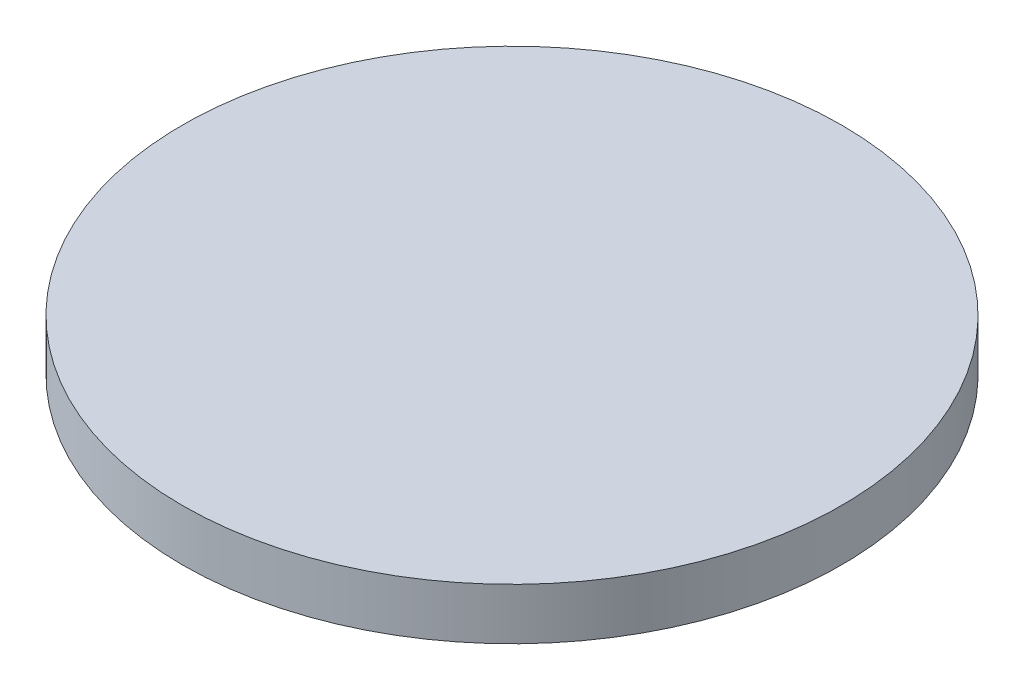
ISO-10303-21;
HEADER;
FILE_DESCRIPTION(('STEP AP214'),'2;1');
FILE_NAME('part.step','',(''),(''),'','','');
FILE_SCHEMA(('AUTOMOTIVE_DESIGN { 1 0 10303 214 1 1 1 1 }'));
ENDSEC;
DATA;
#1=APPLICATION_CONTEXT('core data for automotive mechanical design processes');
#2=APPLICATION_PROTOCOL_DEFINITION('international standard','automotive_design',2000,#1);
#3=PRODUCT_CONTEXT('',#1,'mechanical');
#4=PRODUCT('Part','Part','',(#3));
#5=PRODUCT_RELATED_PRODUCT_CATEGORY('part','',(#4));
#6=PRODUCT_DEFINITION_FORMATION('','',#4);
#7=PRODUCT_DEFINITION_CONTEXT('part definition',#1,'design');
#8=PRODUCT_DEFINITION('design','',#6,#7);
#9=PRODUCT_DEFINITION_SHAPE('','',#8);
#10=(LENGTH_UNIT() NAMED_UNIT(*) SI_UNIT(.MILLI.,.METRE.));
#11=(NAMED_UNIT(*) PLANE_ANGLE_UNIT() SI_UNIT($,.RADIAN.));
#12=(NAMED_UNIT(*) SI_UNIT($,.STERADIAN.) SOLID_ANGLE_UNIT());
#13=UNCERTAINTY_MEASURE_WITH_UNIT(LENGTH_MEASURE(1.E-05),#10,'distance_accuracy_value','');
#14=(GEOMETRIC_REPRESENTATION_CONTEXT(3) GLOBAL_UNCERTAINTY_ASSIGNED_CONTEXT((#13)) GLOBAL_UNIT_ASSIGNED_CONTEXT((#10,
#11,#12)) REPRESENTATION_CONTEXT('',''));
#15=CARTESIAN_POINT('',(0.,0.,0.));
#16=DIRECTION('',(0.,0.,1.));
#17=DIRECTION('',(1.,0.,0.));
#18=AXIS2_PLACEMENT_3D('',#15,#16,#17);
#19=CARTESIAN_POINT('',(0.,50.,0.));
#20=DIRECTION('',(0.,-1.,0.));
#21=DIRECTION('',(0.,0.,-1.));
#22=AXIS2_PLACEMENT_3D('',#19,#20,#21);
#23=CYLINDRICAL_SURFACE('',#22,320.);
#24=CARTESIAN_POINT('',(0.,50.,0.));
#25=DIRECTION('',(0.,1.,0.));
#26=DIRECTION('',(0.,0.,1.));
#27=AXIS2_PLACEMENT_3D('',#24,#25,#26);
#28=CIRCLE('',#27,320.);
#29=CARTESIAN_POINT('',(0.,50.,320.));
#30=VERTEX_POINT('',#29);
#31=EDGE_CURVE('E38',#30,#30,#28,.T.);
#32=ORIENTED_EDGE('',*,*,#31,.F.);
#33=EDGE_LOOP('',(#32));
#34=FACE_BOUND('',#33,.T.);
#35=CARTESIAN_POINT('',(0.,0.,0.));
#36=DIRECTION('',(0.,1.,0.));
#37=DIRECTION('',(0.,0.,1.));
#38=AXIS2_PLACEMENT_3D('',#35,#36,#37);
#39=CIRCLE('',#38,320.);
#40=CARTESIAN_POINT('',(0.,0.,320.));
#41=VERTEX_POINT('',#40);
#42=EDGE_CURVE('E42',#41,#41,#39,.T.);
#43=ORIENTED_EDGE('',*,*,#42,.T.);
#44=EDGE_LOOP('',(#43));
#45=FACE_BOUND('',#44,.T.);
#46=ADVANCED_FACE('F32',(#34,#45),#23,.T.);
#47=CARTESIAN_POINT('',(0.,50.,0.));
#48=DIRECTION('',(0.,1.,0.));
#49=DIRECTION('',(0.,0.,1.));
#50=AXIS2_PLACEMENT_3D('',#47,#48,#49);
#51=PLANE('',#50);
#52=ORIENTED_EDGE('',*,*,#31,.T.);
#53=EDGE_LOOP('',(#52));
#54=FACE_BOUND('',#53,.T.);
#55=ADVANCED_FACE('F63',(#54),#51,.T.);
#56=CARTESIAN_POINT('',(0.,0.,0.));
#57=DIRECTION('',(0.,1.,0.));
#58=DIRECTION('',(0.,0.,1.));
#59=AXIS2_PLACEMENT_3D('',#56,#57,#58);
#60=PLANE('',#59);
#61=CARTESIAN_POINT('',(0.,0.,0.));
#62=DIRECTION('',(0.,1.,0.));
#63=DIRECTION('',(0.,0.,1.));
#64=AXIS2_PLACEMENT_3D('',#61,#62,#63);
#65=CIRCLE('',#64,32.5);
#66=CARTESIAN_POINT('',(0.,0.,32.5));
#67=VERTEX_POINT('',#66);
#68=EDGE_CURVE('E10',#67,#67,#65,.F.);
#69=ORIENTED_EDGE('',*,*,#68,.F.);
#70=EDGE_LOOP('',(#69));
#71=FACE_BOUND('',#70,.T.);
#72=ORIENTED_EDGE('',*,*,#42,.F.);
#73=EDGE_LOOP('',(#72));
#74=FACE_BOUND('',#73,.T.);
#75=ADVANCED_FACE('F56',(#71,#74),#60,.F.);
#76=CARTESIAN_POINT('',(0.,-15.,0.));
#77=DIRECTION('',(0.,1.,0.));
#78=DIRECTION('',(0.,0.,1.));
#79=AXIS2_PLACEMENT_3D('',#76,#77,#78);
#80=CYLINDRICAL_SURFACE('',#79,32.5);
#81=CARTESIAN_POINT('',(0.,-15.,0.));
#82=DIRECTION('',(0.,-1.,0.));
#83=DIRECTION('',(0.,0.,-1.));
#84=AXIS2_PLACEMENT_3D('',#81,#82,#83);
#85=CIRCLE('',#84,32.5);
#86=CARTESIAN_POINT('',(0.,-15.,-32.5));
#87=VERTEX_POINT('',#86);
#88=EDGE_CURVE('E47',#87,#87,#85,.T.);
#89=ORIENTED_EDGE('',*,*,#88,.F.);
#90=EDGE_LOOP('',(#89));
#91=FACE_BOUND('',#90,.T.);
#92=ORIENTED_EDGE('',*,*,#68,.T.);
#93=EDGE_LOOP('',(#92));
#94=FACE_BOUND('',#93,.T.);
#95=ADVANCED_FACE('F54',(#91,#94),#80,.T.);
#96=CARTESIAN_POINT('',(0.,-15.,0.));
#97=DIRECTION('',(0.,-1.,0.));
#98=DIRECTION('',(0.,0.,-1.));
#99=AXIS2_PLACEMENT_3D('',#96,#97,#98);
#100=PLANE('',#99);
#101=ORIENTED_EDGE('',*,*,#88,.T.);
#102=EDGE_LOOP('',(#101));
#103=FACE_BOUND('',#102,.T.);
#104=ADVANCED_FACE('F52',(#103),#100,.T.);
#105=CLOSED_SHELL('',(#46,#55,#75,#95,#104));
#106=MANIFOLD_SOLID_BREP('B2',#105);
#107=ADVANCED_BREP_SHAPE_REPRESENTATION('',(#18,#106),#14);
#108=SHAPE_DEFINITION_REPRESENTATION(#9,#107);
ENDSEC;
END-ISO-10303-21;
